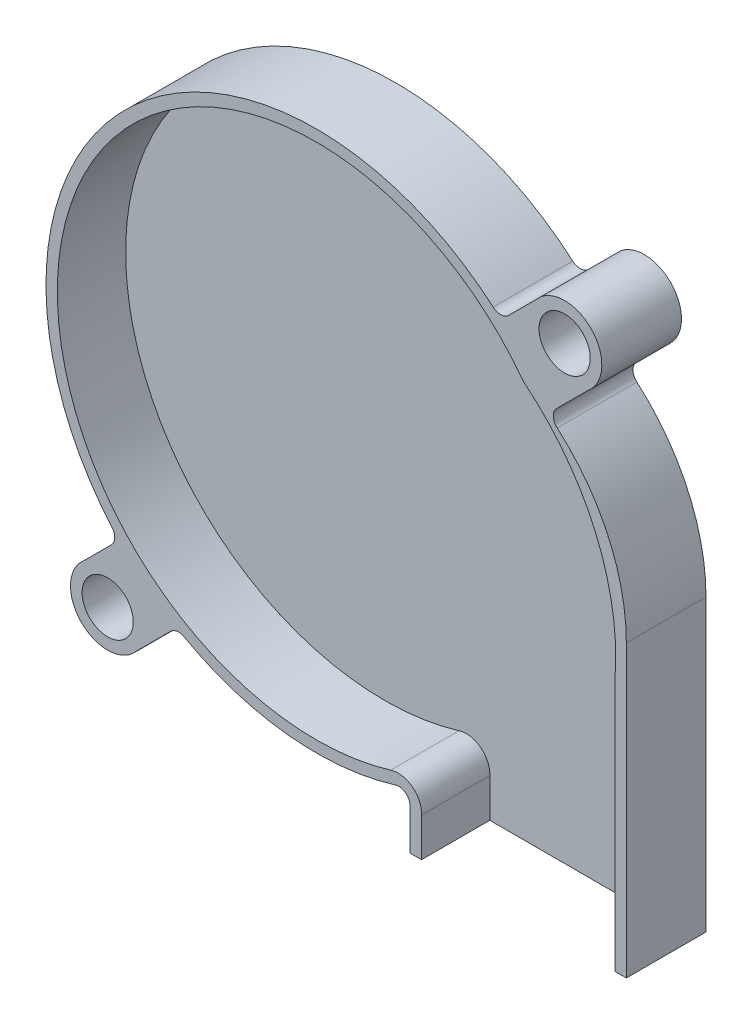
ISO-10303-21;
HEADER;
FILE_DESCRIPTION(('STEP AP214'),'2;1');
FILE_NAME('part.step','',(''),(''),'','','');
FILE_SCHEMA(('AUTOMOTIVE_DESIGN { 1 0 10303 214 1 1 1 1 }'));
ENDSEC;
DATA;
#1=APPLICATION_CONTEXT('core data for automotive mechanical design processes');
#2=APPLICATION_PROTOCOL_DEFINITION('international standard','automotive_design',2000,#1);
#3=PRODUCT_CONTEXT('',#1,'mechanical');
#4=PRODUCT('Part','Part','',(#3));
#5=PRODUCT_RELATED_PRODUCT_CATEGORY('part','',(#4));
#6=PRODUCT_DEFINITION_FORMATION('','',#4);
#7=PRODUCT_DEFINITION_CONTEXT('part definition',#1,'design');
#8=PRODUCT_DEFINITION('design','',#6,#7);
#9=PRODUCT_DEFINITION_SHAPE('','',#8);
#10=(LENGTH_UNIT() NAMED_UNIT(*) SI_UNIT(.MILLI.,.METRE.));
#11=(NAMED_UNIT(*) PLANE_ANGLE_UNIT() SI_UNIT($,.RADIAN.));
#12=(NAMED_UNIT(*) SI_UNIT($,.STERADIAN.) SOLID_ANGLE_UNIT());
#13=UNCERTAINTY_MEASURE_WITH_UNIT(LENGTH_MEASURE(1.E-05),#10,'distance_accuracy_value','');
#14=(GEOMETRIC_REPRESENTATION_CONTEXT(3) GLOBAL_UNCERTAINTY_ASSIGNED_CONTEXT((#13)) GLOBAL_UNIT_ASSIGNED_CONTEXT((#10,
#11,#12)) REPRESENTATION_CONTEXT('',''));
#15=CARTESIAN_POINT('',(0.,0.,0.));
#16=DIRECTION('',(0.,0.,1.));
#17=DIRECTION('',(1.,0.,0.));
#18=AXIS2_PLACEMENT_3D('',#15,#16,#17);
#19=CARTESIAN_POINT('',(45.5819490562044,39.5715414161188,7.));
#20=DIRECTION('',(0.,0.,-1.));
#21=DIRECTION('',(-1.,0.,0.));
#22=AXIS2_PLACEMENT_3D('',#19,#20,#21);
#23=CYLINDRICAL_SURFACE('',#22,1.);
#24=DIRECTION('',(0.,0.,1.));
#25=VECTOR('',#24,1.);
#26=CARTESIAN_POINT('',(44.8748422750179,40.2786481973053,7.));
#27=LINE('',#26,#25);
#28=CARTESIAN_POINT('',(44.8748422750179,40.2786481973053,7.));
#29=VERTEX_POINT('',#28);
#30=CARTESIAN_POINT('',(44.8748422750179,40.2786481973053,0.));
#31=VERTEX_POINT('',#30);
#32=EDGE_CURVE('E298',#29,#31,#27,.F.);
#33=ORIENTED_EDGE('',*,*,#32,.F.);
#34=CARTESIAN_POINT('',(45.5819490562044,39.5715414161188,7.));
#35=DIRECTION('',(0.,0.,1.));
#36=DIRECTION('',(1.,0.,0.));
#37=AXIS2_PLACEMENT_3D('',#34,#35,#36);
#38=CIRCLE('',#37,1.);
#39=CARTESIAN_POINT('',(44.9263590662377,38.816424362242,7.));
#40=VERTEX_POINT('',#39);
#41=EDGE_CURVE('E304',#29,#40,#38,.T.);
#42=ORIENTED_EDGE('',*,*,#41,.T.);
#43=DIRECTION('',(0.,0.,-1.));
#44=VECTOR('',#43,1.);
#45=CARTESIAN_POINT('',(44.9263590662377,38.816424362242,7.));
#46=LINE('',#45,#44);
#47=CARTESIAN_POINT('',(44.9263590662377,38.816424362242,0.));
#48=VERTEX_POINT('',#47);
#49=EDGE_CURVE('E301',#48,#40,#46,.F.);
#50=ORIENTED_EDGE('',*,*,#49,.F.);
#51=CARTESIAN_POINT('',(45.5819490562044,39.5715414161188,0.));
#52=DIRECTION('',(0.,0.,1.));
#53=DIRECTION('',(1.,0.,0.));
#54=AXIS2_PLACEMENT_3D('',#51,#52,#53);
#55=CIRCLE('',#54,1.);
#56=EDGE_CURVE('E306',#48,#31,#55,.F.);
#57=ORIENTED_EDGE('',*,*,#56,.T.);
#58=EDGE_LOOP('',(#33,#42,#50,#57));
#59=FACE_BOUND('',#58,.T.);
#60=ADVANCED_FACE('F33',(#59),#23,.F.);
#61=CARTESIAN_POINT('',(51.,0.,7.));
#62=DIRECTION('',(0.,1.,0.));
#63=DIRECTION('',(-1.,0.,0.));
#64=AXIS2_PLACEMENT_3D('',#61,#62,#63);
#65=PLANE('',#64);
#66=DIRECTION('',(1.,0.,0.));
#67=VECTOR('',#66,1.);
#68=CARTESIAN_POINT('',(33.,0.,1.));
#69=LINE('',#68,#67);
#70=CARTESIAN_POINT('',(33.,0.,1.));
#71=VERTEX_POINT('',#70);
#72=CARTESIAN_POINT('',(50.,0.,1.));
#73=VERTEX_POINT('',#72);
#74=EDGE_CURVE('E194',#71,#73,#69,.T.);
#75=ORIENTED_EDGE('',*,*,#74,.F.);
#76=DIRECTION('',(0.,0.,1.));
#77=VECTOR('',#76,1.);
#78=CARTESIAN_POINT('',(33.,0.,1.));
#79=LINE('',#78,#77);
#80=CARTESIAN_POINT('',(33.,0.,7.));
#81=VERTEX_POINT('',#80);
#82=EDGE_CURVE('E252',#71,#81,#79,.T.);
#83=ORIENTED_EDGE('',*,*,#82,.T.);
#84=DIRECTION('',(1.,0.,0.));
#85=VECTOR('',#84,1.);
#86=CARTESIAN_POINT('',(51.,0.,7.));
#87=LINE('',#86,#85);
#88=CARTESIAN_POINT('',(32.,0.,7.));
#89=VERTEX_POINT('',#88);
#90=EDGE_CURVE('E217',#89,#81,#87,.T.);
#91=ORIENTED_EDGE('',*,*,#90,.F.);
#92=DIRECTION('',(0.,0.,-1.));
#93=VECTOR('',#92,1.);
#94=CARTESIAN_POINT('',(32.,0.,7.));
#95=LINE('',#94,#93);
#96=CARTESIAN_POINT('',(32.,0.,0.));
#97=VERTEX_POINT('',#96);
#98=EDGE_CURVE('E247',#89,#97,#95,.T.);
#99=ORIENTED_EDGE('',*,*,#98,.T.);
#100=DIRECTION('',(1.,0.,0.));
#101=VECTOR('',#100,1.);
#102=CARTESIAN_POINT('',(51.,0.,0.));
#103=LINE('',#102,#101);
#104=CARTESIAN_POINT('',(51.,0.,0.));
#105=VERTEX_POINT('',#104);
#106=EDGE_CURVE('E248',#97,#105,#103,.T.);
#107=ORIENTED_EDGE('',*,*,#106,.T.);
#108=DIRECTION('',(0.,0.,-1.));
#109=VECTOR('',#108,1.);
#110=CARTESIAN_POINT('',(51.,0.,7.));
#111=LINE('',#110,#109);
#112=CARTESIAN_POINT('',(51.,0.,7.));
#113=VERTEX_POINT('',#112);
#114=EDGE_CURVE('E295',#113,#105,#111,.T.);
#115=ORIENTED_EDGE('',*,*,#114,.F.);
#116=CARTESIAN_POINT('',(50.,0.,7.));
#117=VERTEX_POINT('',#116);
#118=EDGE_CURVE('E209',#117,#113,#87,.T.);
#119=ORIENTED_EDGE('',*,*,#118,.F.);
#120=DIRECTION('',(0.,0.,1.));
#121=VECTOR('',#120,1.);
#122=CARTESIAN_POINT('',(50.,0.,1.));
#123=LINE('',#122,#121);
#124=EDGE_CURVE('E48',#73,#117,#123,.T.);
#125=ORIENTED_EDGE('',*,*,#124,.F.);
#126=EDGE_LOOP('',(#75,#83,#91,#99,#107,#115,#119,#125));
#127=FACE_BOUND('',#126,.T.);
#128=ADVANCED_FACE('F207',(#127),#65,.F.);
#129=CARTESIAN_POINT('',(51.,0.,7.));
#130=DIRECTION('',(-1.,0.,0.));
#131=DIRECTION('',(0.,0.,1.));
#132=AXIS2_PLACEMENT_3D('',#129,#130,#131);
#133=PLANE('',#132);
#134=DIRECTION('',(0.,1.,0.));
#135=VECTOR('',#134,1.);
#136=CARTESIAN_POINT('',(51.,0.,0.));
#137=LINE('',#136,#135);
#138=CARTESIAN_POINT('',(51.,25.5,0.));
#139=VERTEX_POINT('',#138);
#140=EDGE_CURVE('E251',#105,#139,#137,.T.);
#141=ORIENTED_EDGE('',*,*,#140,.T.);
#142=DIRECTION('',(0.,0.,-1.));
#143=VECTOR('',#142,1.);
#144=CARTESIAN_POINT('',(51.,25.5,7.));
#145=LINE('',#144,#143);
#146=CARTESIAN_POINT('',(51.,25.5,7.));
#147=VERTEX_POINT('',#146);
#148=EDGE_CURVE('E292',#147,#139,#145,.T.);
#149=ORIENTED_EDGE('',*,*,#148,.F.);
#150=DIRECTION('',(0.,1.,0.));
#151=VECTOR('',#150,1.);
#152=CARTESIAN_POINT('',(51.,0.,7.));
#153=LINE('',#152,#151);
#154=EDGE_CURVE('E220',#113,#147,#153,.T.);
#155=ORIENTED_EDGE('',*,*,#154,.F.);
#156=ORIENTED_EDGE('',*,*,#114,.T.);
#157=EDGE_LOOP('',(#141,#149,#155,#156));
#158=FACE_BOUND('',#157,.T.);
#159=ADVANCED_FACE('F430',(#158),#133,.F.);
#160=CARTESIAN_POINT('',(33.3650859242603,25.5,7.));
#161=DIRECTION('',(0.,0.,-1.));
#162=DIRECTION('',(-1.,0.,0.));
#163=AXIS2_PLACEMENT_3D('',#160,#161,#162);
#164=CYLINDRICAL_SURFACE('',#163,17.6349140757397);
#165=CARTESIAN_POINT('',(33.3650859242603,25.5,0.));
#166=DIRECTION('',(0.,0.,1.));
#167=DIRECTION('',(1.,0.,0.));
#168=AXIS2_PLACEMENT_3D('',#165,#166,#167);
#169=CIRCLE('',#168,17.6349140757397);
#170=EDGE_CURVE('E254',#139,#48,#169,.T.);
#171=ORIENTED_EDGE('',*,*,#170,.T.);
#172=ORIENTED_EDGE('',*,*,#49,.T.);
#173=CARTESIAN_POINT('',(33.3650859242603,25.5,7.));
#174=DIRECTION('',(0.,0.,1.));
#175=DIRECTION('',(1.,0.,0.));
#176=AXIS2_PLACEMENT_3D('',#173,#174,#175);
#177=CIRCLE('',#176,17.6349140757397);
#178=EDGE_CURVE('E222',#147,#40,#177,.T.);
#179=ORIENTED_EDGE('',*,*,#178,.F.);
#180=ORIENTED_EDGE('',*,*,#148,.T.);
#181=EDGE_LOOP('',(#171,#172,#179,#180));
#182=FACE_BOUND('',#181,.T.);
#183=ADVANCED_FACE('F499',(#182),#164,.T.);
#184=CARTESIAN_POINT('',(44.0966908543976,39.5004967766851,7.));
#185=DIRECTION('',(-0.707106781186548,0.707106781186547,0.));
#186=DIRECTION('',(-0.707106781186547,-0.707106781186548,0.));
#187=AXIS2_PLACEMENT_3D('',#184,#185,#186);
#188=PLANE('',#187);
#189=DIRECTION('',(0.707106781186547,0.707106781186548,0.));
#190=VECTOR('',#189,1.);
#191=CARTESIAN_POINT('',(44.0966908543976,39.5004967766851,7.));
#192=LINE('',#191,#190);
#193=CARTESIAN_POINT('',(47.6322247603304,43.0360306826178,7.));
#194=VERTEX_POINT('',#193);
#195=EDGE_CURVE('E225',#29,#194,#192,.T.);
#196=ORIENTED_EDGE('',*,*,#195,.F.);
#197=ORIENTED_EDGE('',*,*,#32,.T.);
#198=DIRECTION('',(0.707106781186547,0.707106781186548,0.));
#199=VECTOR('',#198,1.);
#200=CARTESIAN_POINT('',(44.0966908543976,39.5004967766851,0.));
#201=LINE('',#200,#199);
#202=CARTESIAN_POINT('',(47.6322247603304,43.0360306826178,0.));
#203=VERTEX_POINT('',#202);
#204=EDGE_CURVE('E257',#31,#203,#201,.T.);
#205=ORIENTED_EDGE('',*,*,#204,.T.);
#206=DIRECTION('',(0.,0.,-1.));
#207=VECTOR('',#206,1.);
#208=CARTESIAN_POINT('',(47.6322247603304,43.0360306826178,7.));
#209=LINE('',#208,#207);
#210=EDGE_CURVE('E289',#194,#203,#209,.T.);
#211=ORIENTED_EDGE('',*,*,#210,.F.);
#212=EDGE_LOOP('',(#196,#197,#205,#211));
#213=FACE_BOUND('',#212,.T.);
#214=ADVANCED_FACE('F495',(#213),#188,.F.);
#215=CARTESIAN_POINT('',(45.5772506023579,45.5772506023579,7.));
#216=DIRECTION('',(0.,0.,-1.));
#217=DIRECTION('',(-1.,0.,0.));
#218=AXIS2_PLACEMENT_3D('',#215,#216,#217);
#219=CYLINDRICAL_SURFACE('',#218,3.26813669702147);
#220=CARTESIAN_POINT('',(45.5772506023579,45.5772506023579,0.));
#221=DIRECTION('',(0.,0.,1.));
#222=DIRECTION('',(-1.,0.,0.));
#223=AXIS2_PLACEMENT_3D('',#220,#221,#222);
#224=CIRCLE('',#223,3.26813669702147);
#225=CARTESIAN_POINT('',(43.5222764443854,48.118470522098,0.));
#226=VERTEX_POINT('',#225);
#227=EDGE_CURVE('E259',#203,#226,#224,.T.);
#228=ORIENTED_EDGE('',*,*,#227,.T.);
#229=DIRECTION('',(0.,0.,-1.));
#230=VECTOR('',#229,1.);
#231=CARTESIAN_POINT('',(43.5222764443854,48.118470522098,7.));
#232=LINE('',#231,#230);
#233=CARTESIAN_POINT('',(43.5222764443854,48.118470522098,7.));
#234=VERTEX_POINT('',#233);
#235=EDGE_CURVE('E286',#234,#226,#232,.T.);
#236=ORIENTED_EDGE('',*,*,#235,.F.);
#237=CARTESIAN_POINT('',(45.5772506023579,45.5772506023579,7.));
#238=DIRECTION('',(0.,0.,1.));
#239=DIRECTION('',(-1.,0.,0.));
#240=AXIS2_PLACEMENT_3D('',#237,#238,#239);
#241=CIRCLE('',#240,3.26813669702147);
#242=EDGE_CURVE('E227',#194,#234,#241,.T.);
#243=ORIENTED_EDGE('',*,*,#242,.F.);
#244=ORIENTED_EDGE('',*,*,#210,.T.);
#245=EDGE_LOOP('',(#228,#236,#243,#244));
#246=FACE_BOUND('',#245,.T.);
#247=ADVANCED_FACE('F491',(#246),#219,.T.);
#248=CARTESIAN_POINT('',(39.9867425384527,44.5829366161652,7.));
#249=DIRECTION('',(0.707106781186547,-0.707106781186548,0.));
#250=DIRECTION('',(0.707106781186548,0.707106781186547,0.));
#251=AXIS2_PLACEMENT_3D('',#248,#249,#250);
#252=PLANE('',#251);
#253=DIRECTION('',(-0.707106781186548,-0.707106781186547,0.));
#254=VECTOR('',#253,1.);
#255=CARTESIAN_POINT('',(39.9867425384527,44.5829366161652,0.));
#256=LINE('',#255,#254);
#257=CARTESIAN_POINT('',(40.6577247226693,45.2539188003819,0.));
#258=VERTEX_POINT('',#257);
#259=EDGE_CURVE('E261',#226,#258,#256,.T.);
#260=ORIENTED_EDGE('',*,*,#259,.T.);
#261=DIRECTION('',(0.,0.,1.));
#262=VECTOR('',#261,1.);
#263=CARTESIAN_POINT('',(40.6577247226693,45.2539188003819,7.));
#264=LINE('',#263,#262);
#265=CARTESIAN_POINT('',(40.6577247226693,45.2539188003819,7.));
#266=VERTEX_POINT('',#265);
#267=EDGE_CURVE('E321',#258,#266,#264,.T.);
#268=ORIENTED_EDGE('',*,*,#267,.T.);
#269=DIRECTION('',(-0.707106781186548,-0.707106781186547,0.));
#270=VECTOR('',#269,1.);
#271=CARTESIAN_POINT('',(39.9867425384527,44.5829366161652,7.));
#272=LINE('',#271,#270);
#273=EDGE_CURVE('E229',#234,#266,#272,.T.);
#274=ORIENTED_EDGE('',*,*,#273,.F.);
#275=ORIENTED_EDGE('',*,*,#235,.T.);
#276=EDGE_LOOP('',(#260,#268,#274,#275));
#277=FACE_BOUND('',#276,.T.);
#278=ADVANCED_FACE('F488',(#277),#252,.F.);
#279=CARTESIAN_POINT('',(23.75,27.25,7.));
#280=DIRECTION('',(0.,0.,-1.));
#281=DIRECTION('',(-1.,0.,0.));
#282=AXIS2_PLACEMENT_3D('',#279,#280,#281);
#283=CYLINDRICAL_SURFACE('',#282,23.75);
#284=CARTESIAN_POINT('',(23.75,27.25,0.));
#285=DIRECTION('',(0.,0.,1.));
#286=DIRECTION('',(1.,0.,0.));
#287=AXIS2_PLACEMENT_3D('',#284,#285,#286);
#288=CIRCLE('',#287,23.75);
#289=CARTESIAN_POINT('',(39.2960475196047,45.2050245479697,0.));
#290=VERTEX_POINT('',#289);
#291=CARTESIAN_POINT('',(5.79497545203032,11.7039524803953,0.));
#292=VERTEX_POINT('',#291);
#293=EDGE_CURVE('E264',#290,#292,#288,.T.);
#294=ORIENTED_EDGE('',*,*,#293,.T.);
#295=DIRECTION('',(0.,0.,-1.));
#296=VECTOR('',#295,1.);
#297=CARTESIAN_POINT('',(5.79497545203032,11.7039524803953,7.));
#298=LINE('',#297,#296);
#299=CARTESIAN_POINT('',(5.79497545203032,11.7039524803953,7.));
#300=VERTEX_POINT('',#299);
#301=EDGE_CURVE('E314',#292,#300,#298,.F.);
#302=ORIENTED_EDGE('',*,*,#301,.T.);
#303=CARTESIAN_POINT('',(23.75,27.25,7.));
#304=DIRECTION('',(0.,0.,1.));
#305=DIRECTION('',(1.,0.,0.));
#306=AXIS2_PLACEMENT_3D('',#303,#304,#305);
#307=CIRCLE('',#306,23.75);
#308=CARTESIAN_POINT('',(39.2960475196047,45.2050245479697,7.));
#309=VERTEX_POINT('',#308);
#310=EDGE_CURVE('E232',#309,#300,#307,.T.);
#311=ORIENTED_EDGE('',*,*,#310,.F.);
#312=DIRECTION('',(0.,0.,-1.));
#313=VECTOR('',#312,1.);
#314=CARTESIAN_POINT('',(39.2960475196047,45.2050245479697,7.));
#315=LINE('',#314,#313);
#316=EDGE_CURVE('E311',#309,#290,#315,.T.);
#317=ORIENTED_EDGE('',*,*,#316,.T.);
#318=EDGE_LOOP('',(#294,#302,#311,#317));
#319=FACE_BOUND('',#318,.T.);
#320=ADVANCED_FACE('F455',(#319),#283,.T.);
#321=CARTESIAN_POINT('',(6.41706338383477,11.0132574615473,7.));
#322=DIRECTION('',(0.707106781186547,-0.707106781186548,0.));
#323=DIRECTION('',(0.707106781186548,0.707106781186547,0.));
#324=AXIS2_PLACEMENT_3D('',#321,#322,#323);
#325=PLANE('',#324);
#326=DIRECTION('',(-0.707106781186548,-0.707106781186547,0.));
#327=VECTOR('',#326,1.);
#328=CARTESIAN_POINT('',(6.41706338383477,11.0132574615473,7.));
#329=LINE('',#328,#327);
#330=CARTESIAN_POINT('',(5.74608119961814,10.3422752773307,7.));
#331=VERTEX_POINT('',#330);
#332=CARTESIAN_POINT('',(2.88152947790204,7.47772355561459,7.));
#333=VERTEX_POINT('',#332);
#334=EDGE_CURVE('E235',#331,#333,#329,.T.);
#335=ORIENTED_EDGE('',*,*,#334,.F.);
#336=DIRECTION('',(0.,0.,1.));
#337=VECTOR('',#336,1.);
#338=CARTESIAN_POINT('',(5.74608119961814,10.3422752773307,0.));
#339=LINE('',#338,#337);
#340=CARTESIAN_POINT('',(5.74608119961814,10.3422752773307,0.));
#341=VERTEX_POINT('',#340);
#342=EDGE_CURVE('E308',#331,#341,#339,.F.);
#343=ORIENTED_EDGE('',*,*,#342,.T.);
#344=DIRECTION('',(-0.707106781186548,-0.707106781186547,0.));
#345=VECTOR('',#344,1.);
#346=CARTESIAN_POINT('',(6.41706338383477,11.0132574615473,0.));
#347=LINE('',#346,#345);
#348=CARTESIAN_POINT('',(2.88152947790204,7.47772355561459,0.));
#349=VERTEX_POINT('',#348);
#350=EDGE_CURVE('E267',#341,#349,#347,.T.);
#351=ORIENTED_EDGE('',*,*,#350,.T.);
#352=DIRECTION('',(0.,0.,-1.));
#353=VECTOR('',#352,1.);
#354=CARTESIAN_POINT('',(2.88152947790204,7.47772355561459,7.));
#355=LINE('',#354,#353);
#356=EDGE_CURVE('E283',#333,#349,#355,.T.);
#357=ORIENTED_EDGE('',*,*,#356,.F.);
#358=EDGE_LOOP('',(#335,#343,#351,#357));
#359=FACE_BOUND('',#358,.T.);
#360=ADVANCED_FACE('F462',(#359),#325,.F.);
#361=CARTESIAN_POINT('',(5.42274939764211,5.42274939764211,7.));
#362=DIRECTION('',(0.,0.,-1.));
#363=DIRECTION('',(-1.,0.,0.));
#364=AXIS2_PLACEMENT_3D('',#361,#362,#363);
#365=CYLINDRICAL_SURFACE('',#364,3.26813669702148);
#366=CARTESIAN_POINT('',(5.42274939764211,5.42274939764211,0.));
#367=DIRECTION('',(0.,0.,1.));
#368=DIRECTION('',(1.,0.,0.));
#369=AXIS2_PLACEMENT_3D('',#366,#367,#368);
#370=CIRCLE('',#369,3.26813669702148);
#371=CARTESIAN_POINT('',(7.96396931738219,3.36777523966963,0.));
#372=VERTEX_POINT('',#371);
#373=EDGE_CURVE('E269',#349,#372,#370,.T.);
#374=ORIENTED_EDGE('',*,*,#373,.T.);
#375=DIRECTION('',(0.,0.,-1.));
#376=VECTOR('',#375,1.);
#377=CARTESIAN_POINT('',(7.96396931738219,3.36777523966963,7.));
#378=LINE('',#377,#376);
#379=CARTESIAN_POINT('',(7.96396931738219,3.36777523966963,7.));
#380=VERTEX_POINT('',#379);
#381=EDGE_CURVE('E280',#380,#372,#378,.T.);
#382=ORIENTED_EDGE('',*,*,#381,.F.);
#383=CARTESIAN_POINT('',(5.42274939764211,5.42274939764211,7.));
#384=DIRECTION('',(0.,0.,1.));
#385=DIRECTION('',(1.,0.,0.));
#386=AXIS2_PLACEMENT_3D('',#383,#384,#385);
#387=CIRCLE('',#386,3.26813669702148);
#388=EDGE_CURVE('E237',#333,#380,#387,.T.);
#389=ORIENTED_EDGE('',*,*,#388,.F.);
#390=ORIENTED_EDGE('',*,*,#356,.T.);
#391=EDGE_LOOP('',(#374,#382,#389,#390));
#392=FACE_BOUND('',#391,.T.);
#393=ADVANCED_FACE('F468',(#392),#365,.T.);
#394=CARTESIAN_POINT('',(11.4995032233149,6.90330914560237,7.));
#395=DIRECTION('',(-0.707106781186548,0.707106781186547,0.));
#396=DIRECTION('',(-0.707106781186547,-0.707106781186548,0.));
#397=AXIS2_PLACEMENT_3D('',#394,#395,#396);
#398=PLANE('',#397);
#399=DIRECTION('',(0.707106781186547,0.707106781186548,0.));
#400=VECTOR('',#399,1.);
#401=CARTESIAN_POINT('',(11.4995032233149,6.90330914560237,0.));
#402=LINE('',#401,#400);
#403=CARTESIAN_POINT('',(10.955612464725,6.35941838701244,0.));
#404=VERTEX_POINT('',#403);
#405=EDGE_CURVE('E271',#372,#404,#402,.T.);
#406=ORIENTED_EDGE('',*,*,#405,.T.);
#407=DIRECTION('',(0.,0.,1.));
#408=VECTOR('',#407,1.);
#409=CARTESIAN_POINT('',(10.955612464725,6.35941838701244,7.));
#410=LINE('',#409,#408);
#411=CARTESIAN_POINT('',(10.955612464725,6.35941838701244,7.));
#412=VERTEX_POINT('',#411);
#413=EDGE_CURVE('E319',#404,#412,#410,.T.);
#414=ORIENTED_EDGE('',*,*,#413,.T.);
#415=DIRECTION('',(0.707106781186547,0.707106781186548,0.));
#416=VECTOR('',#415,1.);
#417=CARTESIAN_POINT('',(11.4995032233149,6.90330914560237,7.));
#418=LINE('',#417,#416);
#419=EDGE_CURVE('E239',#380,#412,#418,.T.);
#420=ORIENTED_EDGE('',*,*,#419,.F.);
#421=ORIENTED_EDGE('',*,*,#381,.T.);
#422=EDGE_LOOP('',(#406,#414,#420,#421));
#423=FACE_BOUND('',#422,.T.);
#424=ADVANCED_FACE('F473',(#423),#398,.F.);
#425=CARTESIAN_POINT('',(23.75,27.25,7.));
#426=DIRECTION('',(0.,0.,-1.));
#427=DIRECTION('',(-1.,0.,0.));
#428=AXIS2_PLACEMENT_3D('',#425,#426,#427);
#429=CYLINDRICAL_SURFACE('',#428,23.75);
#430=CARTESIAN_POINT('',(23.75,27.25,0.));
#431=DIRECTION('',(0.,0.,1.));
#432=DIRECTION('',(1.,0.,0.));
#433=AXIS2_PLACEMENT_3D('',#430,#431,#432);
#434=CIRCLE('',#433,23.75);
#435=CARTESIAN_POINT('',(12.1510942258747,6.52494548033798,0.));
#436=VERTEX_POINT('',#435);
#437=CARTESIAN_POINT('',(30.7070707070707,4.54181497396107,0.));
#438=VERTEX_POINT('',#437);
#439=EDGE_CURVE('E274',#436,#438,#434,.T.);
#440=ORIENTED_EDGE('',*,*,#439,.T.);
#441=DIRECTION('',(0.,0.,-1.));
#442=VECTOR('',#441,1.);
#443=CARTESIAN_POINT('',(30.7070707070707,4.54181497396107,7.));
#444=LINE('',#443,#442);
#445=CARTESIAN_POINT('',(30.7070707070707,4.54181497396107,7.));
#446=VERTEX_POINT('',#445);
#447=EDGE_CURVE('E338',#438,#446,#444,.F.);
#448=ORIENTED_EDGE('',*,*,#447,.T.);
#449=CARTESIAN_POINT('',(23.75,27.25,7.));
#450=DIRECTION('',(0.,0.,1.));
#451=DIRECTION('',(1.,0.,0.));
#452=AXIS2_PLACEMENT_3D('',#449,#450,#451);
#453=CIRCLE('',#452,23.75);
#454=CARTESIAN_POINT('',(12.1510942258747,6.52494548033798,7.));
#455=VERTEX_POINT('',#454);
#456=EDGE_CURVE('E242',#455,#446,#453,.T.);
#457=ORIENTED_EDGE('',*,*,#456,.F.);
#458=DIRECTION('',(0.,0.,-1.));
#459=VECTOR('',#458,1.);
#460=CARTESIAN_POINT('',(12.1510942258747,6.52494548033798,7.));
#461=LINE('',#460,#459);
#462=EDGE_CURVE('E316',#455,#436,#461,.T.);
#463=ORIENTED_EDGE('',*,*,#462,.T.);
#464=EDGE_LOOP('',(#440,#448,#457,#463));
#465=FACE_BOUND('',#464,.T.);
#466=ADVANCED_FACE('F342',(#465),#429,.T.);
#467=CARTESIAN_POINT('',(32.,0.,7.));
#468=DIRECTION('',(1.,0.,0.));
#469=DIRECTION('',(0.,0.,-1.));
#470=AXIS2_PLACEMENT_3D('',#467,#468,#469);
#471=PLANE('',#470);
#472=DIRECTION('',(0.,-1.,0.));
#473=VECTOR('',#472,1.);
#474=CARTESIAN_POINT('',(32.,0.,7.));
#475=LINE('',#474,#473);
#476=CARTESIAN_POINT('',(32.,3.58568086760154,7.));
#477=VERTEX_POINT('',#476);
#478=EDGE_CURVE('E245',#477,#89,#475,.T.);
#479=ORIENTED_EDGE('',*,*,#478,.F.);
#480=DIRECTION('',(0.,0.,1.));
#481=VECTOR('',#480,1.);
#482=CARTESIAN_POINT('',(32.,3.58568086760154,0.));
#483=LINE('',#482,#481);
#484=CARTESIAN_POINT('',(32.,3.58568086760154,0.));
#485=VERTEX_POINT('',#484);
#486=EDGE_CURVE('E335',#477,#485,#483,.F.);
#487=ORIENTED_EDGE('',*,*,#486,.T.);
#488=DIRECTION('',(0.,-1.,0.));
#489=VECTOR('',#488,1.);
#490=CARTESIAN_POINT('',(32.,0.,0.));
#491=LINE('',#490,#489);
#492=EDGE_CURVE('E276',#485,#97,#491,.T.);
#493=ORIENTED_EDGE('',*,*,#492,.T.);
#494=ORIENTED_EDGE('',*,*,#98,.F.);
#495=EDGE_LOOP('',(#479,#487,#493,#494));
#496=FACE_BOUND('',#495,.T.);
#497=ADVANCED_FACE('F353',(#496),#471,.F.);
#498=CARTESIAN_POINT('',(23.75,27.25,7.));
#499=DIRECTION('',(0.,0.,1.));
#500=DIRECTION('',(1.,0.,0.));
#501=AXIS2_PLACEMENT_3D('',#498,#499,#500);
#502=PLANE('',#501);
#503=CARTESIAN_POINT('',(5.42274939764211,5.42274939764211,7.));
#504=DIRECTION('',(0.,0.,-1.));
#505=DIRECTION('',(-1.,0.,0.));
#506=AXIS2_PLACEMENT_3D('',#503,#504,#505);
#507=CIRCLE('',#506,2.25);
#508=CARTESIAN_POINT('',(3.17274939764211,5.42274939764211,7.));
#509=VERTEX_POINT('',#508);
#510=EDGE_CURVE('E397',#509,#509,#507,.T.);
#511=ORIENTED_EDGE('',*,*,#510,.T.);
#512=EDGE_LOOP('',(#511));
#513=FACE_BOUND('',#512,.T.);
#514=CARTESIAN_POINT('',(45.5772506023579,45.5772506023579,7.));
#515=DIRECTION('',(0.,0.,-1.));
#516=DIRECTION('',(-1.,0.,0.));
#517=AXIS2_PLACEMENT_3D('',#514,#515,#516);
#518=CIRCLE('',#517,2.25);
#519=CARTESIAN_POINT('',(43.3272506023579,45.5772506023579,7.));
#520=VERTEX_POINT('',#519);
#521=EDGE_CURVE('E387',#520,#520,#518,.T.);
#522=ORIENTED_EDGE('',*,*,#521,.T.);
#523=EDGE_LOOP('',(#522));
#524=FACE_BOUND('',#523,.T.);
#525=DIRECTION('',(0.,-1.,0.));
#526=VECTOR('',#525,1.);
#527=CARTESIAN_POINT('',(33.,0.,7.));
#528=LINE('',#527,#526);
#529=CARTESIAN_POINT('',(33.,3.38983605314777,7.));
#530=VERTEX_POINT('',#529);
#531=EDGE_CURVE('E204',#530,#81,#528,.T.);
#532=ORIENTED_EDGE('',*,*,#531,.F.);
#533=CARTESIAN_POINT('',(30.9468271327487,3.51136079606299,7.));
#534=DIRECTION('',(0.,0.,-1.));
#535=DIRECTION('',(1.,0.,0.));
#536=AXIS2_PLACEMENT_3D('',#533,#534,#535);
#537=CIRCLE('',#536,2.05676617192079);
#538=CARTESIAN_POINT('',(30.2866825601807,5.45930746608935,7.));
#539=VERTEX_POINT('',#538);
#540=EDGE_CURVE('E362',#539,#530,#537,.T.);
#541=ORIENTED_EDGE('',*,*,#540,.F.);
#542=CARTESIAN_POINT('',(23.75,27.25,7.));
#543=DIRECTION('',(0.,0.,1.));
#544=DIRECTION('',(1.,0.,0.));
#545=AXIS2_PLACEMENT_3D('',#542,#543,#544);
#546=CIRCLE('',#545,22.75);
#547=CARTESIAN_POINT('',(41.9922823792657,40.8434408298683,7.));
#548=VERTEX_POINT('',#547);
#549=EDGE_CURVE('E365',#548,#539,#546,.T.);
#550=ORIENTED_EDGE('',*,*,#549,.F.);
#551=CARTESIAN_POINT('',(28.3602637846714,23.9484033738144,7.));
#552=DIRECTION('',(0.,0.,1.));
#553=DIRECTION('',(1.,0.,0.));
#554=AXIS2_PLACEMENT_3D('',#551,#552,#553);
#555=CIRCLE('',#554,21.7088512272029);
#556=CARTESIAN_POINT('',(50.,22.2174966357645,7.));
#557=VERTEX_POINT('',#556);
#558=EDGE_CURVE('E382',#557,#548,#555,.T.);
#559=ORIENTED_EDGE('',*,*,#558,.F.);
#560=DIRECTION('',(0.,1.,0.));
#561=VECTOR('',#560,1.);
#562=CARTESIAN_POINT('',(50.,0.,7.));
#563=LINE('',#562,#561);
#564=EDGE_CURVE('E384',#117,#557,#563,.T.);
#565=ORIENTED_EDGE('',*,*,#564,.F.);
#566=ORIENTED_EDGE('',*,*,#118,.T.);
#567=ORIENTED_EDGE('',*,*,#154,.T.);
#568=ORIENTED_EDGE('',*,*,#178,.T.);
#569=ORIENTED_EDGE('',*,*,#41,.F.);
#570=ORIENTED_EDGE('',*,*,#195,.T.);
#571=ORIENTED_EDGE('',*,*,#242,.T.);
#572=ORIENTED_EDGE('',*,*,#273,.T.);
#573=CARTESIAN_POINT('',(39.9506179414828,45.9610255815684,7.));
#574=DIRECTION('',(0.,0.,1.));
#575=DIRECTION('',(1.,0.,0.));
#576=AXIS2_PLACEMENT_3D('',#573,#574,#575);
#577=CIRCLE('',#576,1.);
#578=EDGE_CURVE('E333',#266,#309,#577,.F.);
#579=ORIENTED_EDGE('',*,*,#578,.T.);
#580=ORIENTED_EDGE('',*,*,#310,.T.);
#581=CARTESIAN_POINT('',(5.03897441843159,11.0493820585172,7.));
#582=DIRECTION('',(0.,0.,1.));
#583=DIRECTION('',(1.,0.,0.));
#584=AXIS2_PLACEMENT_3D('',#581,#582,#583);
#585=CIRCLE('',#584,1.);
#586=EDGE_CURVE('E325',#300,#331,#585,.F.);
#587=ORIENTED_EDGE('',*,*,#586,.T.);
#588=ORIENTED_EDGE('',*,*,#334,.T.);
#589=ORIENTED_EDGE('',*,*,#388,.T.);
#590=ORIENTED_EDGE('',*,*,#419,.T.);
#591=CARTESIAN_POINT('',(11.6627192459115,5.65231160582589,7.));
#592=DIRECTION('',(0.,0.,1.));
#593=DIRECTION('',(1.,0.,0.));
#594=AXIS2_PLACEMENT_3D('',#591,#592,#593);
#595=CIRCLE('',#594,1.);
#596=EDGE_CURVE('E329',#412,#455,#595,.F.);
#597=ORIENTED_EDGE('',*,*,#596,.T.);
#598=ORIENTED_EDGE('',*,*,#456,.T.);
#599=CARTESIAN_POINT('',(31.,3.58568086760154,7.));
#600=DIRECTION('',(0.,0.,1.));
#601=DIRECTION('',(1.,0.,0.));
#602=AXIS2_PLACEMENT_3D('',#599,#600,#601);
#603=CIRCLE('',#602,1.);
#604=EDGE_CURVE('E11',#446,#477,#603,.F.);
#605=ORIENTED_EDGE('',*,*,#604,.T.);
#606=ORIENTED_EDGE('',*,*,#478,.T.);
#607=ORIENTED_EDGE('',*,*,#90,.T.);
#608=EDGE_LOOP('',(#532,#541,#550,#559,#565,#566,#567,#568,#569,#570,#571,#572,#579,#580,#587,
#588,#589,#590,#597,#598,#605,#606,#607));
#609=FACE_BOUND('',#608,.T.);
#610=ADVANCED_FACE('F348',(#513,#524,#609),#502,.T.);
#611=CARTESIAN_POINT('',(23.75,27.25,0.));
#612=DIRECTION('',(0.,0.,1.));
#613=DIRECTION('',(1.,0.,0.));
#614=AXIS2_PLACEMENT_3D('',#611,#612,#613);
#615=PLANE('',#614);
#616=CARTESIAN_POINT('',(5.42274939764211,5.42274939764211,0.));
#617=DIRECTION('',(0.,0.,-1.));
#618=DIRECTION('',(-1.,0.,0.));
#619=AXIS2_PLACEMENT_3D('',#616,#617,#618);
#620=CIRCLE('',#619,2.25);
#621=CARTESIAN_POINT('',(3.17274939764211,5.42274939764211,0.));
#622=VERTEX_POINT('',#621);
#623=EDGE_CURVE('E400',#622,#622,#620,.T.);
#624=ORIENTED_EDGE('',*,*,#623,.F.);
#625=EDGE_LOOP('',(#624));
#626=FACE_BOUND('',#625,.T.);
#627=CARTESIAN_POINT('',(45.5772506023579,45.5772506023579,0.));
#628=DIRECTION('',(0.,0.,-1.));
#629=DIRECTION('',(-1.,0.,0.));
#630=AXIS2_PLACEMENT_3D('',#627,#628,#629);
#631=CIRCLE('',#630,2.25);
#632=CARTESIAN_POINT('',(43.3272506023579,45.5772506023579,0.));
#633=VERTEX_POINT('',#632);
#634=EDGE_CURVE('E394',#633,#633,#631,.T.);
#635=ORIENTED_EDGE('',*,*,#634,.F.);
#636=EDGE_LOOP('',(#635));
#637=FACE_BOUND('',#636,.T.);
#638=ORIENTED_EDGE('',*,*,#106,.F.);
#639=ORIENTED_EDGE('',*,*,#492,.F.);
#640=CARTESIAN_POINT('',(31.,3.58568086760154,0.));
#641=DIRECTION('',(0.,0.,1.));
#642=DIRECTION('',(1.,0.,0.));
#643=AXIS2_PLACEMENT_3D('',#640,#641,#642);
#644=CIRCLE('',#643,1.);
#645=EDGE_CURVE('E41',#485,#438,#644,.T.);
#646=ORIENTED_EDGE('',*,*,#645,.T.);
#647=ORIENTED_EDGE('',*,*,#439,.F.);
#648=CARTESIAN_POINT('',(11.6627192459115,5.65231160582589,0.));
#649=DIRECTION('',(0.,0.,1.));
#650=DIRECTION('',(1.,0.,0.));
#651=AXIS2_PLACEMENT_3D('',#648,#649,#650);
#652=CIRCLE('',#651,1.);
#653=EDGE_CURVE('E327',#436,#404,#652,.T.);
#654=ORIENTED_EDGE('',*,*,#653,.T.);
#655=ORIENTED_EDGE('',*,*,#405,.F.);
#656=ORIENTED_EDGE('',*,*,#373,.F.);
#657=ORIENTED_EDGE('',*,*,#350,.F.);
#658=CARTESIAN_POINT('',(5.03897441843159,11.0493820585172,0.));
#659=DIRECTION('',(0.,0.,1.));
#660=DIRECTION('',(1.,0.,0.));
#661=AXIS2_PLACEMENT_3D('',#658,#659,#660);
#662=CIRCLE('',#661,1.);
#663=EDGE_CURVE('E323',#341,#292,#662,.T.);
#664=ORIENTED_EDGE('',*,*,#663,.T.);
#665=ORIENTED_EDGE('',*,*,#293,.F.);
#666=CARTESIAN_POINT('',(39.9506179414828,45.9610255815684,0.));
#667=DIRECTION('',(0.,0.,1.));
#668=DIRECTION('',(1.,0.,0.));
#669=AXIS2_PLACEMENT_3D('',#666,#667,#668);
#670=CIRCLE('',#669,1.);
#671=EDGE_CURVE('E331',#290,#258,#670,.T.);
#672=ORIENTED_EDGE('',*,*,#671,.T.);
#673=ORIENTED_EDGE('',*,*,#259,.F.);
#674=ORIENTED_EDGE('',*,*,#227,.F.);
#675=ORIENTED_EDGE('',*,*,#204,.F.);
#676=ORIENTED_EDGE('',*,*,#56,.F.);
#677=ORIENTED_EDGE('',*,*,#170,.F.);
#678=ORIENTED_EDGE('',*,*,#140,.F.);
#679=EDGE_LOOP('',(#638,#639,#646,#647,#654,#655,#656,#657,#664,#665,#672,#673,#674,#675,#676,
#677,#678));
#680=FACE_BOUND('',#679,.T.);
#681=ADVANCED_FACE('F356',(#626,#637,#680),#615,.F.);
#682=CARTESIAN_POINT('',(5.03897441843159,11.0493820585172,7.));
#683=DIRECTION('',(0.,0.,-1.));
#684=DIRECTION('',(-1.,0.,0.));
#685=AXIS2_PLACEMENT_3D('',#682,#683,#684);
#686=CYLINDRICAL_SURFACE('',#685,1.);
#687=ORIENTED_EDGE('',*,*,#586,.F.);
#688=ORIENTED_EDGE('',*,*,#301,.F.);
#689=ORIENTED_EDGE('',*,*,#663,.F.);
#690=ORIENTED_EDGE('',*,*,#342,.F.);
#691=EDGE_LOOP('',(#687,#688,#689,#690));
#692=FACE_BOUND('',#691,.T.);
#693=ADVANCED_FACE('F408',(#692),#686,.F.);
#694=CARTESIAN_POINT('',(11.6627192459115,5.65231160582589,7.));
#695=DIRECTION('',(0.,0.,-1.));
#696=DIRECTION('',(-1.,0.,0.));
#697=AXIS2_PLACEMENT_3D('',#694,#695,#696);
#698=CYLINDRICAL_SURFACE('',#697,1.);
#699=ORIENTED_EDGE('',*,*,#596,.F.);
#700=ORIENTED_EDGE('',*,*,#413,.F.);
#701=ORIENTED_EDGE('',*,*,#653,.F.);
#702=ORIENTED_EDGE('',*,*,#462,.F.);
#703=EDGE_LOOP('',(#699,#700,#701,#702));
#704=FACE_BOUND('',#703,.T.);
#705=ADVANCED_FACE('F437',(#704),#698,.F.);
#706=CARTESIAN_POINT('',(39.9506179414828,45.9610255815684,7.));
#707=DIRECTION('',(0.,0.,-1.));
#708=DIRECTION('',(-1.,0.,0.));
#709=AXIS2_PLACEMENT_3D('',#706,#707,#708);
#710=CYLINDRICAL_SURFACE('',#709,1.);
#711=ORIENTED_EDGE('',*,*,#578,.F.);
#712=ORIENTED_EDGE('',*,*,#267,.F.);
#713=ORIENTED_EDGE('',*,*,#671,.F.);
#714=ORIENTED_EDGE('',*,*,#316,.F.);
#715=EDGE_LOOP('',(#711,#712,#713,#714));
#716=FACE_BOUND('',#715,.T.);
#717=ADVANCED_FACE('F440',(#716),#710,.F.);
#718=CARTESIAN_POINT('',(31.,3.58568086760154,7.));
#719=DIRECTION('',(0.,0.,-1.));
#720=DIRECTION('',(-1.,0.,0.));
#721=AXIS2_PLACEMENT_3D('',#718,#719,#720);
#722=CYLINDRICAL_SURFACE('',#721,1.);
#723=ORIENTED_EDGE('',*,*,#604,.F.);
#724=ORIENTED_EDGE('',*,*,#447,.F.);
#725=ORIENTED_EDGE('',*,*,#645,.F.);
#726=ORIENTED_EDGE('',*,*,#486,.F.);
#727=EDGE_LOOP('',(#723,#724,#725,#726));
#728=FACE_BOUND('',#727,.T.);
#729=ADVANCED_FACE('F35',(#728),#722,.F.);
#730=CARTESIAN_POINT('',(33.,0.,1.));
#731=DIRECTION('',(-1.,0.,0.));
#732=DIRECTION('',(0.,0.,1.));
#733=AXIS2_PLACEMENT_3D('',#730,#731,#732);
#734=PLANE('',#733);
#735=ORIENTED_EDGE('',*,*,#531,.T.);
#736=ORIENTED_EDGE('',*,*,#82,.F.);
#737=DIRECTION('',(0.,-1.,0.));
#738=VECTOR('',#737,1.);
#739=CARTESIAN_POINT('',(33.,0.,1.));
#740=LINE('',#739,#738);
#741=CARTESIAN_POINT('',(33.,3.38983605314777,1.));
#742=VERTEX_POINT('',#741);
#743=EDGE_CURVE('E201',#742,#71,#740,.T.);
#744=ORIENTED_EDGE('',*,*,#743,.F.);
#745=DIRECTION('',(0.,0.,1.));
#746=VECTOR('',#745,1.);
#747=CARTESIAN_POINT('',(33.,3.38983605314777,1.));
#748=LINE('',#747,#746);
#749=EDGE_CURVE('E370',#742,#530,#748,.T.);
#750=ORIENTED_EDGE('',*,*,#749,.T.);
#751=EDGE_LOOP('',(#735,#736,#744,#750));
#752=FACE_BOUND('',#751,.T.);
#753=ADVANCED_FACE('F447',(#752),#734,.F.);
#754=CARTESIAN_POINT('',(30.9468271327487,3.51136079606299,1.));
#755=DIRECTION('',(0.,0.,1.));
#756=DIRECTION('',(1.,0.,0.));
#757=AXIS2_PLACEMENT_3D('',#754,#755,#756);
#758=CYLINDRICAL_SURFACE('',#757,2.05676617192079);
#759=ORIENTED_EDGE('',*,*,#540,.T.);
#760=ORIENTED_EDGE('',*,*,#749,.F.);
#761=CARTESIAN_POINT('',(30.9468271327487,3.51136079606299,1.));
#762=DIRECTION('',(0.,0.,-1.));
#763=DIRECTION('',(1.,0.,0.));
#764=AXIS2_PLACEMENT_3D('',#761,#762,#763);
#765=CIRCLE('',#764,2.05676617192079);
#766=CARTESIAN_POINT('',(30.2866825601807,5.45930746608935,1.));
#767=VERTEX_POINT('',#766);
#768=EDGE_CURVE('E213',#767,#742,#765,.T.);
#769=ORIENTED_EDGE('',*,*,#768,.F.);
#770=DIRECTION('',(0.,0.,1.));
#771=VECTOR('',#770,1.);
#772=CARTESIAN_POINT('',(30.2866825601807,5.45930746608935,1.));
#773=LINE('',#772,#771);
#774=EDGE_CURVE('E372',#767,#539,#773,.T.);
#775=ORIENTED_EDGE('',*,*,#774,.T.);
#776=EDGE_LOOP('',(#759,#760,#769,#775));
#777=FACE_BOUND('',#776,.T.);
#778=ADVANCED_FACE('F589',(#777),#758,.T.);
#779=CARTESIAN_POINT('',(23.75,27.25,1.));
#780=DIRECTION('',(0.,0.,1.));
#781=DIRECTION('',(1.,0.,0.));
#782=AXIS2_PLACEMENT_3D('',#779,#780,#781);
#783=CYLINDRICAL_SURFACE('',#782,22.75);
#784=ORIENTED_EDGE('',*,*,#549,.T.);
#785=ORIENTED_EDGE('',*,*,#774,.F.);
#786=CARTESIAN_POINT('',(23.75,27.25,1.));
#787=DIRECTION('',(0.,0.,1.));
#788=DIRECTION('',(1.,0.,0.));
#789=AXIS2_PLACEMENT_3D('',#786,#787,#788);
#790=CIRCLE('',#789,22.75);
#791=CARTESIAN_POINT('',(41.9922823792657,40.8434408298683,1.));
#792=VERTEX_POINT('',#791);
#793=EDGE_CURVE('E379',#792,#767,#790,.T.);
#794=ORIENTED_EDGE('',*,*,#793,.F.);
#795=DIRECTION('',(0.,0.,1.));
#796=VECTOR('',#795,1.);
#797=CARTESIAN_POINT('',(41.9922823792657,40.8434408298683,1.));
#798=LINE('',#797,#796);
#799=EDGE_CURVE('E211',#792,#548,#798,.T.);
#800=ORIENTED_EDGE('',*,*,#799,.T.);
#801=EDGE_LOOP('',(#784,#785,#794,#800));
#802=FACE_BOUND('',#801,.T.);
#803=ADVANCED_FACE('F377',(#802),#783,.F.);
#804=CARTESIAN_POINT('',(28.3602637846714,23.9484033738144,1.));
#805=DIRECTION('',(0.,0.,1.));
#806=DIRECTION('',(1.,0.,0.));
#807=AXIS2_PLACEMENT_3D('',#804,#805,#806);
#808=CYLINDRICAL_SURFACE('',#807,21.7088512272029);
#809=ORIENTED_EDGE('',*,*,#558,.T.);
#810=ORIENTED_EDGE('',*,*,#799,.F.);
#811=CARTESIAN_POINT('',(28.3602637846714,23.9484033738144,1.));
#812=DIRECTION('',(0.,0.,1.));
#813=DIRECTION('',(1.,0.,0.));
#814=AXIS2_PLACEMENT_3D('',#811,#812,#813);
#815=CIRCLE('',#814,21.7088512272029);
#816=CARTESIAN_POINT('',(50.,22.2174966357645,1.));
#817=VERTEX_POINT('',#816);
#818=EDGE_CURVE('E193',#817,#792,#815,.T.);
#819=ORIENTED_EDGE('',*,*,#818,.F.);
#820=DIRECTION('',(0.,0.,1.));
#821=VECTOR('',#820,1.);
#822=CARTESIAN_POINT('',(50.,22.2174966357645,1.));
#823=LINE('',#822,#821);
#824=EDGE_CURVE('E189',#817,#557,#823,.T.);
#825=ORIENTED_EDGE('',*,*,#824,.T.);
#826=EDGE_LOOP('',(#809,#810,#819,#825));
#827=FACE_BOUND('',#826,.T.);
#828=ADVANCED_FACE('F383',(#827),#808,.F.);
#829=CARTESIAN_POINT('',(50.,0.,1.));
#830=DIRECTION('',(1.,0.,0.));
#831=DIRECTION('',(0.,0.,-1.));
#832=AXIS2_PLACEMENT_3D('',#829,#830,#831);
#833=PLANE('',#832);
#834=ORIENTED_EDGE('',*,*,#564,.T.);
#835=ORIENTED_EDGE('',*,*,#824,.F.);
#836=DIRECTION('',(0.,1.,0.));
#837=VECTOR('',#836,1.);
#838=CARTESIAN_POINT('',(50.,0.,1.));
#839=LINE('',#838,#837);
#840=EDGE_CURVE('E186',#73,#817,#839,.T.);
#841=ORIENTED_EDGE('',*,*,#840,.F.);
#842=ORIENTED_EDGE('',*,*,#124,.T.);
#843=EDGE_LOOP('',(#834,#835,#841,#842));
#844=FACE_BOUND('',#843,.T.);
#845=ADVANCED_FACE('F188',(#844),#833,.F.);
#846=CARTESIAN_POINT('',(28.3602637846714,23.9484033738144,1.));
#847=DIRECTION('',(0.,0.,1.));
#848=DIRECTION('',(1.,0.,0.));
#849=AXIS2_PLACEMENT_3D('',#846,#847,#848);
#850=PLANE('',#849);
#851=ORIENTED_EDGE('',*,*,#74,.T.);
#852=ORIENTED_EDGE('',*,*,#840,.T.);
#853=ORIENTED_EDGE('',*,*,#818,.T.);
#854=ORIENTED_EDGE('',*,*,#793,.T.);
#855=ORIENTED_EDGE('',*,*,#768,.T.);
#856=ORIENTED_EDGE('',*,*,#743,.T.);
#857=EDGE_LOOP('',(#851,#852,#853,#854,#855,#856));
#858=FACE_BOUND('',#857,.T.);
#859=ADVANCED_FACE('F198',(#858),#850,.T.);
#860=CARTESIAN_POINT('',(45.5772506023579,45.5772506023579,0.));
#861=DIRECTION('',(0.,0.,-1.));
#862=DIRECTION('',(-1.,0.,0.));
#863=AXIS2_PLACEMENT_3D('',#860,#861,#862);
#864=CYLINDRICAL_SURFACE('',#863,2.25);
#865=ORIENTED_EDGE('',*,*,#521,.F.);
#866=EDGE_LOOP('',(#865));
#867=FACE_BOUND('',#866,.T.);
#868=ORIENTED_EDGE('',*,*,#634,.T.);
#869=EDGE_LOOP('',(#868));
#870=FACE_BOUND('',#869,.T.);
#871=ADVANCED_FACE('F412',(#867,#870),#864,.F.);
#872=CARTESIAN_POINT('',(5.42274939764211,5.42274939764211,0.));
#873=DIRECTION('',(0.,0.,-1.));
#874=DIRECTION('',(-1.,0.,0.));
#875=AXIS2_PLACEMENT_3D('',#872,#873,#874);
#876=CYLINDRICAL_SURFACE('',#875,2.25);
#877=ORIENTED_EDGE('',*,*,#510,.F.);
#878=EDGE_LOOP('',(#877));
#879=FACE_BOUND('',#878,.T.);
#880=ORIENTED_EDGE('',*,*,#623,.T.);
#881=EDGE_LOOP('',(#880));
#882=FACE_BOUND('',#881,.T.);
#883=ADVANCED_FACE('F404',(#879,#882),#876,.F.);
#884=CLOSED_SHELL('',(#60,#128,#159,#183,#214,#247,#278,#320,#360,#393,#424,#466,#497,#610,#681,
#693,#705,#717,#729,#753,#778,#803,#828,#845,#859,#871,#883));
#885=MANIFOLD_SOLID_BREP('B2',#884);
#886=ADVANCED_BREP_SHAPE_REPRESENTATION('',(#18,#885),#14);
#887=SHAPE_DEFINITION_REPRESENTATION(#9,#886);
ENDSEC;
END-ISO-10303-21;
